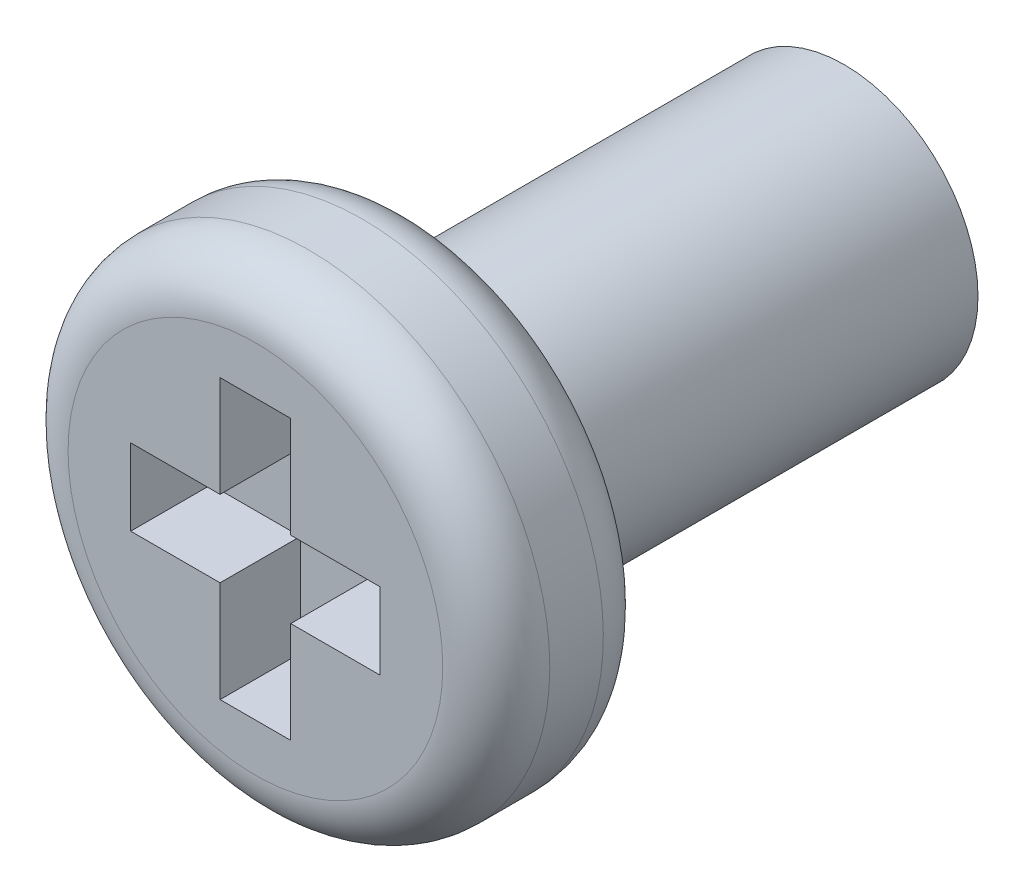
ISO-10303-21;
HEADER;
FILE_DESCRIPTION(('STEP AP214'),'2;1');
FILE_NAME('part.step','',(''),(''),'','','');
FILE_SCHEMA(('AUTOMOTIVE_DESIGN { 1 0 10303 214 1 1 1 1 }'));
ENDSEC;
DATA;
#1=APPLICATION_CONTEXT('core data for automotive mechanical design processes');
#2=APPLICATION_PROTOCOL_DEFINITION('international standard','automotive_design',2000,#1);
#3=PRODUCT_CONTEXT('',#1,'mechanical');
#4=PRODUCT('Part','Part','',(#3));
#5=PRODUCT_RELATED_PRODUCT_CATEGORY('part','',(#4));
#6=PRODUCT_DEFINITION_FORMATION('','',#4);
#7=PRODUCT_DEFINITION_CONTEXT('part definition',#1,'design');
#8=PRODUCT_DEFINITION('design','',#6,#7);
#9=PRODUCT_DEFINITION_SHAPE('','',#8);
#10=(LENGTH_UNIT() NAMED_UNIT(*) SI_UNIT(.MILLI.,.METRE.));
#11=(NAMED_UNIT(*) PLANE_ANGLE_UNIT() SI_UNIT($,.RADIAN.));
#12=(NAMED_UNIT(*) SI_UNIT($,.STERADIAN.) SOLID_ANGLE_UNIT());
#13=UNCERTAINTY_MEASURE_WITH_UNIT(LENGTH_MEASURE(1.E-05),#10,'distance_accuracy_value','');
#14=(GEOMETRIC_REPRESENTATION_CONTEXT(3) GLOBAL_UNCERTAINTY_ASSIGNED_CONTEXT((#13)) GLOBAL_UNIT_ASSIGNED_CONTEXT((#10,
#11,#12)) REPRESENTATION_CONTEXT('',''));
#15=CARTESIAN_POINT('',(0.,0.,0.));
#16=DIRECTION('',(0.,0.,1.));
#17=DIRECTION('',(1.,0.,0.));
#18=AXIS2_PLACEMENT_3D('',#15,#16,#17);
#19=CARTESIAN_POINT('',(-102.7186651452,22.56986742742,59.8));
#20=DIRECTION('',(0.,0.,1.));
#21=DIRECTION('',(0.,1.,0.));
#22=AXIS2_PLACEMENT_3D('',#19,#20,#21);
#23=PLANE('',#22);
#24=DIRECTION('',(1.,0.,0.));
#25=VECTOR('',#24,1.);
#26=CARTESIAN_POINT('',(-106.6368651452,24.56406742742,59.8));
#27=LINE('',#26,#25);
#28=CARTESIAN_POINT('',(-107.4718651452,24.56406742742,59.8));
#29=VERTEX_POINT('',#28);
#30=CARTESIAN_POINT('',(-105.8018651452,24.56406742742,59.8));
#31=VERTEX_POINT('',#30);
#32=EDGE_CURVE('E137',#29,#31,#27,.T.);
#33=ORIENTED_EDGE('',*,*,#32,.T.);
#34=DIRECTION('',(0.,-1.,0.));
#35=VECTOR('',#34,1.);
#36=CARTESIAN_POINT('',(-105.8018651452,23.61906742742,59.8));
#37=LINE('',#36,#35);
#38=CARTESIAN_POINT('',(-105.8018651452,22.67406742742,59.8));
#39=VERTEX_POINT('',#38);
#40=EDGE_CURVE('E119',#31,#39,#37,.T.);
#41=ORIENTED_EDGE('',*,*,#40,.T.);
#42=DIRECTION('',(1.,0.,0.));
#43=VECTOR('',#42,1.);
#44=CARTESIAN_POINT('',(-105.1418651452,22.67406742742,59.8));
#45=LINE('',#44,#43);
#46=CARTESIAN_POINT('',(-104.4818651452,22.67406742742,59.8));
#47=VERTEX_POINT('',#46);
#48=EDGE_CURVE('E125',#39,#47,#45,.T.);
#49=ORIENTED_EDGE('',*,*,#48,.T.);
#50=DIRECTION('',(0.,1.,0.));
#51=VECTOR('',#50,1.);
#52=CARTESIAN_POINT('',(-104.4818651452,23.61906742742,59.8));
#53=LINE('',#52,#51);
#54=CARTESIAN_POINT('',(-104.4818651452,24.56406742742,59.8));
#55=VERTEX_POINT('',#54);
#56=EDGE_CURVE('E261',#47,#55,#53,.T.);
#57=ORIENTED_EDGE('',*,*,#56,.T.);
#58=DIRECTION('',(1.,0.,0.));
#59=VECTOR('',#58,1.);
#60=CARTESIAN_POINT('',(-103.6468651452,24.56406742742,59.8));
#61=LINE('',#60,#59);
#62=CARTESIAN_POINT('',(-102.8118651452,24.56406742742,59.8));
#63=VERTEX_POINT('',#62);
#64=EDGE_CURVE('E267',#55,#63,#61,.T.);
#65=ORIENTED_EDGE('',*,*,#64,.T.);
#66=DIRECTION('',(0.,1.,0.));
#67=VECTOR('',#66,1.);
#68=CARTESIAN_POINT('',(-102.8118651452,25.27906742742,59.8));
#69=LINE('',#68,#67);
#70=CARTESIAN_POINT('',(-102.8118651452,25.99406742742,59.8));
#71=VERTEX_POINT('',#70);
#72=EDGE_CURVE('E273',#63,#71,#69,.T.);
#73=ORIENTED_EDGE('',*,*,#72,.T.);
#74=DIRECTION('',(-1.,0.,0.));
#75=VECTOR('',#74,1.);
#76=CARTESIAN_POINT('',(-103.6468651452,25.99406742742,59.8));
#77=LINE('',#76,#75);
#78=CARTESIAN_POINT('',(-104.4818651452,25.99406742742,59.8));
#79=VERTEX_POINT('',#78);
#80=EDGE_CURVE('E279',#71,#79,#77,.T.);
#81=ORIENTED_EDGE('',*,*,#80,.T.);
#82=DIRECTION('',(0.,1.,0.));
#83=VECTOR('',#82,1.);
#84=CARTESIAN_POINT('',(-104.4818651452,26.93906742742,59.8));
#85=LINE('',#84,#83);
#86=CARTESIAN_POINT('',(-104.4818651452,27.88406742742,59.8));
#87=VERTEX_POINT('',#86);
#88=EDGE_CURVE('E285',#79,#87,#85,.T.);
#89=ORIENTED_EDGE('',*,*,#88,.T.);
#90=DIRECTION('',(-1.,0.,0.));
#91=VECTOR('',#90,1.);
#92=CARTESIAN_POINT('',(-105.1418651452,27.88406742742,59.8));
#93=LINE('',#92,#91);
#94=CARTESIAN_POINT('',(-105.8018651452,27.88406742742,59.8));
#95=VERTEX_POINT('',#94);
#96=EDGE_CURVE('E291',#87,#95,#93,.T.);
#97=ORIENTED_EDGE('',*,*,#96,.T.);
#98=DIRECTION('',(0.,-1.,0.));
#99=VECTOR('',#98,1.);
#100=CARTESIAN_POINT('',(-105.8018651452,26.93906742742,59.8));
#101=LINE('',#100,#99);
#102=CARTESIAN_POINT('',(-105.8018651452,25.99406742742,59.8));
#103=VERTEX_POINT('',#102);
#104=EDGE_CURVE('E297',#95,#103,#101,.T.);
#105=ORIENTED_EDGE('',*,*,#104,.T.);
#106=DIRECTION('',(-1.,0.,0.));
#107=VECTOR('',#106,1.);
#108=CARTESIAN_POINT('',(-106.6368651452,25.99406742742,59.8));
#109=LINE('',#108,#107);
#110=CARTESIAN_POINT('',(-107.4718651452,25.99406742742,59.8));
#111=VERTEX_POINT('',#110);
#112=EDGE_CURVE('E303',#103,#111,#109,.T.);
#113=ORIENTED_EDGE('',*,*,#112,.T.);
#114=DIRECTION('',(0.,-1.,0.));
#115=VECTOR('',#114,1.);
#116=CARTESIAN_POINT('',(-107.4718651452,25.27906742742,59.8));
#117=LINE('',#116,#115);
#118=EDGE_CURVE('E309',#111,#29,#117,.T.);
#119=ORIENTED_EDGE('',*,*,#118,.T.);
#120=EDGE_LOOP('',(#33,#41,#49,#57,#65,#73,#81,#89,#97,#105,#113,#119));
#121=FACE_BOUND('',#120,.T.);
#122=ADVANCED_FACE('F17',(#121),#23,.T.);
#123=CARTESIAN_POINT('',(-105.8282651452,22.67406742742,59.77));
#124=DIRECTION('',(0.,-1.,0.));
#125=DIRECTION('',(1.,0.,0.));
#126=AXIS2_PLACEMENT_3D('',#123,#124,#125);
#127=PLANE('',#126);
#128=ORIENTED_EDGE('',*,*,#48,.F.);
#129=DIRECTION('',(0.,0.,1.));
#130=VECTOR('',#129,1.);
#131=CARTESIAN_POINT('',(-105.8018651452,22.67406742742,60.55));
#132=LINE('',#131,#130);
#133=CARTESIAN_POINT('',(-105.8018651452,22.6740674274205,61.3));
#134=VERTEX_POINT('',#133);
#135=EDGE_CURVE('E128',#39,#134,#132,.T.);
#136=ORIENTED_EDGE('',*,*,#135,.T.);
#137=DIRECTION('',(-1.,0.,0.));
#138=VECTOR('',#137,1.);
#139=CARTESIAN_POINT('',(-105.1418651452,22.6740674274222,61.3));
#140=LINE('',#139,#138);
#141=CARTESIAN_POINT('',(-104.4818651452,22.6740674274205,61.3));
#142=VERTEX_POINT('',#141);
#143=EDGE_CURVE('E260',#142,#134,#140,.T.);
#144=ORIENTED_EDGE('',*,*,#143,.F.);
#145=DIRECTION('',(0.,0.,-1.));
#146=VECTOR('',#145,1.);
#147=CARTESIAN_POINT('',(-104.4818651452,22.67406742742,60.55));
#148=LINE('',#147,#146);
#149=EDGE_CURVE('E130',#142,#47,#148,.T.);
#150=ORIENTED_EDGE('',*,*,#149,.T.);
#151=EDGE_LOOP('',(#128,#136,#144,#150));
#152=FACE_BOUND('',#151,.T.);
#153=ADVANCED_FACE('F126',(#152),#127,.F.);
#154=CARTESIAN_POINT('',(-105.8018651452,24.60186742742,59.77));
#155=DIRECTION('',(-1.,0.,0.));
#156=DIRECTION('',(0.,-1.,0.));
#157=AXIS2_PLACEMENT_3D('',#154,#155,#156);
#158=PLANE('',#157);
#159=ORIENTED_EDGE('',*,*,#40,.F.);
#160=DIRECTION('',(0.,0.,1.));
#161=VECTOR('',#160,1.);
#162=CARTESIAN_POINT('',(-105.8018651452,24.56406742742,60.55));
#163=LINE('',#162,#161);
#164=CARTESIAN_POINT('',(-105.8018651452,24.5640674274201,61.3));
#165=VERTEX_POINT('',#164);
#166=EDGE_CURVE('E311',#31,#165,#163,.T.);
#167=ORIENTED_EDGE('',*,*,#166,.T.);
#168=DIRECTION('',(0.,1.,0.));
#169=VECTOR('',#168,1.);
#170=CARTESIAN_POINT('',(-105.8018651452,25.27906742742,61.3));
#171=LINE('',#170,#169);
#172=EDGE_CURVE('E136',#134,#165,#171,.T.);
#173=ORIENTED_EDGE('',*,*,#172,.F.);
#174=ORIENTED_EDGE('',*,*,#135,.F.);
#175=EDGE_LOOP('',(#159,#167,#173,#174));
#176=FACE_BOUND('',#175,.T.);
#177=ADVANCED_FACE('F135',(#176),#158,.F.);
#178=CARTESIAN_POINT('',(-107.5052651452,24.56406742742,59.77));
#179=DIRECTION('',(0.,-1.,0.));
#180=DIRECTION('',(1.,0.,0.));
#181=AXIS2_PLACEMENT_3D('',#178,#179,#180);
#182=PLANE('',#181);
#183=ORIENTED_EDGE('',*,*,#32,.F.);
#184=DIRECTION('',(0.,0.,1.));
#185=VECTOR('',#184,1.);
#186=CARTESIAN_POINT('',(-107.4718651452,24.56406742742,60.55));
#187=LINE('',#186,#185);
#188=CARTESIAN_POINT('',(-107.4718651452,24.5640674274201,61.3));
#189=VERTEX_POINT('',#188);
#190=EDGE_CURVE('E306',#29,#189,#187,.T.);
#191=ORIENTED_EDGE('',*,*,#190,.T.);
#192=DIRECTION('',(-1.,0.,0.));
#193=VECTOR('',#192,1.);
#194=CARTESIAN_POINT('',(-105.1418651452,24.5640674274206,61.3));
#195=LINE('',#194,#193);
#196=EDGE_CURVE('E314',#165,#189,#195,.T.);
#197=ORIENTED_EDGE('',*,*,#196,.F.);
#198=ORIENTED_EDGE('',*,*,#166,.F.);
#199=EDGE_LOOP('',(#183,#191,#197,#198));
#200=FACE_BOUND('',#199,.T.);
#201=ADVANCED_FACE('F315',(#200),#182,.F.);
#202=CARTESIAN_POINT('',(-107.4718651452,26.02266742742,59.77));
#203=DIRECTION('',(-1.,0.,0.));
#204=DIRECTION('',(0.,-1.,0.));
#205=AXIS2_PLACEMENT_3D('',#202,#203,#204);
#206=PLANE('',#205);
#207=ORIENTED_EDGE('',*,*,#118,.F.);
#208=DIRECTION('',(0.,0.,1.));
#209=VECTOR('',#208,1.);
#210=CARTESIAN_POINT('',(-107.4718651452,25.99406742742,60.55));
#211=LINE('',#210,#209);
#212=CARTESIAN_POINT('',(-107.4718651452,25.9940674274199,61.3));
#213=VERTEX_POINT('',#212);
#214=EDGE_CURVE('E300',#111,#213,#211,.T.);
#215=ORIENTED_EDGE('',*,*,#214,.T.);
#216=DIRECTION('',(0.,1.,0.));
#217=VECTOR('',#216,1.);
#218=CARTESIAN_POINT('',(-107.4718651452,25.27906742742,61.3));
#219=LINE('',#218,#217);
#220=EDGE_CURVE('E318',#189,#213,#219,.T.);
#221=ORIENTED_EDGE('',*,*,#220,.F.);
#222=ORIENTED_EDGE('',*,*,#190,.F.);
#223=EDGE_LOOP('',(#207,#215,#221,#222));
#224=FACE_BOUND('',#223,.T.);
#225=ADVANCED_FACE('F368',(#224),#206,.F.);
#226=CARTESIAN_POINT('',(-105.7684651452,25.99406742742,59.77));
#227=DIRECTION('',(0.,1.,0.));
#228=DIRECTION('',(-1.,0.,0.));
#229=AXIS2_PLACEMENT_3D('',#226,#227,#228);
#230=PLANE('',#229);
#231=ORIENTED_EDGE('',*,*,#112,.F.);
#232=DIRECTION('',(0.,0.,1.));
#233=VECTOR('',#232,1.);
#234=CARTESIAN_POINT('',(-105.8018651452,25.99406742742,60.55));
#235=LINE('',#234,#233);
#236=CARTESIAN_POINT('',(-105.8018651452,25.9940674274199,61.3));
#237=VERTEX_POINT('',#236);
#238=EDGE_CURVE('E294',#103,#237,#235,.T.);
#239=ORIENTED_EDGE('',*,*,#238,.T.);
#240=DIRECTION('',(1.,0.,0.));
#241=VECTOR('',#240,1.);
#242=CARTESIAN_POINT('',(-105.1418651452,25.9940674274194,61.3));
#243=LINE('',#242,#241);
#244=EDGE_CURVE('E320',#213,#237,#243,.T.);
#245=ORIENTED_EDGE('',*,*,#244,.F.);
#246=ORIENTED_EDGE('',*,*,#214,.F.);
#247=EDGE_LOOP('',(#231,#239,#245,#246));
#248=FACE_BOUND('',#247,.T.);
#249=ADVANCED_FACE('F345',(#248),#230,.F.);
#250=CARTESIAN_POINT('',(-105.8018651452,27.92186742742,59.77));
#251=DIRECTION('',(-1.,0.,0.));
#252=DIRECTION('',(0.,-1.,0.));
#253=AXIS2_PLACEMENT_3D('',#250,#251,#252);
#254=PLANE('',#253);
#255=ORIENTED_EDGE('',*,*,#104,.F.);
#256=DIRECTION('',(0.,0.,1.));
#257=VECTOR('',#256,1.);
#258=CARTESIAN_POINT('',(-105.8018651452,27.88406742742,60.55));
#259=LINE('',#258,#257);
#260=CARTESIAN_POINT('',(-105.8018651452,27.8840674274194,61.3));
#261=VERTEX_POINT('',#260);
#262=EDGE_CURVE('E288',#95,#261,#259,.T.);
#263=ORIENTED_EDGE('',*,*,#262,.T.);
#264=DIRECTION('',(0.,1.,0.));
#265=VECTOR('',#264,1.);
#266=CARTESIAN_POINT('',(-105.8018651452,25.27906742742,61.3));
#267=LINE('',#266,#265);
#268=EDGE_CURVE('E339',#237,#261,#267,.T.);
#269=ORIENTED_EDGE('',*,*,#268,.F.);
#270=ORIENTED_EDGE('',*,*,#238,.F.);
#271=EDGE_LOOP('',(#255,#263,#269,#270));
#272=FACE_BOUND('',#271,.T.);
#273=ADVANCED_FACE('F347',(#272),#254,.F.);
#274=CARTESIAN_POINT('',(-104.4554651452,27.88406742742,59.77));
#275=DIRECTION('',(0.,1.,0.));
#276=DIRECTION('',(-1.,0.,0.));
#277=AXIS2_PLACEMENT_3D('',#274,#275,#276);
#278=PLANE('',#277);
#279=ORIENTED_EDGE('',*,*,#96,.F.);
#280=DIRECTION('',(0.,0.,1.));
#281=VECTOR('',#280,1.);
#282=CARTESIAN_POINT('',(-104.4818651452,27.88406742742,60.55));
#283=LINE('',#282,#281);
#284=CARTESIAN_POINT('',(-104.4818651452,27.8840674274195,61.3));
#285=VERTEX_POINT('',#284);
#286=EDGE_CURVE('E282',#87,#285,#283,.T.);
#287=ORIENTED_EDGE('',*,*,#286,.T.);
#288=DIRECTION('',(1.,0.,0.));
#289=VECTOR('',#288,1.);
#290=CARTESIAN_POINT('',(-105.1418651452,27.8840674274179,61.3));
#291=LINE('',#290,#289);
#292=EDGE_CURVE('E337',#261,#285,#291,.T.);
#293=ORIENTED_EDGE('',*,*,#292,.F.);
#294=ORIENTED_EDGE('',*,*,#262,.F.);
#295=EDGE_LOOP('',(#279,#287,#293,#294));
#296=FACE_BOUND('',#295,.T.);
#297=ADVANCED_FACE('F351',(#296),#278,.F.);
#298=CARTESIAN_POINT('',(-104.4818651452,25.95626742742,59.77));
#299=DIRECTION('',(1.,0.,0.));
#300=DIRECTION('',(0.,1.,0.));
#301=AXIS2_PLACEMENT_3D('',#298,#299,#300);
#302=PLANE('',#301);
#303=ORIENTED_EDGE('',*,*,#88,.F.);
#304=DIRECTION('',(0.,0.,1.));
#305=VECTOR('',#304,1.);
#306=CARTESIAN_POINT('',(-104.4818651452,25.99406742742,60.55));
#307=LINE('',#306,#305);
#308=CARTESIAN_POINT('',(-104.4818651452,25.9940674274199,61.3));
#309=VERTEX_POINT('',#308);
#310=EDGE_CURVE('E276',#79,#309,#307,.T.);
#311=ORIENTED_EDGE('',*,*,#310,.T.);
#312=DIRECTION('',(0.,-1.,0.));
#313=VECTOR('',#312,1.);
#314=CARTESIAN_POINT('',(-104.4818651452,25.27906742742,61.3));
#315=LINE('',#314,#313);
#316=EDGE_CURVE('E335',#285,#309,#315,.T.);
#317=ORIENTED_EDGE('',*,*,#316,.F.);
#318=ORIENTED_EDGE('',*,*,#286,.F.);
#319=EDGE_LOOP('',(#303,#311,#317,#318));
#320=FACE_BOUND('',#319,.T.);
#321=ADVANCED_FACE('F357',(#320),#302,.F.);
#322=CARTESIAN_POINT('',(-102.7784651452,25.99406742742,59.77));
#323=DIRECTION('',(0.,1.,0.));
#324=DIRECTION('',(-1.,0.,0.));
#325=AXIS2_PLACEMENT_3D('',#322,#323,#324);
#326=PLANE('',#325);
#327=ORIENTED_EDGE('',*,*,#80,.F.);
#328=DIRECTION('',(0.,0.,1.));
#329=VECTOR('',#328,1.);
#330=CARTESIAN_POINT('',(-102.8118651452,25.99406742742,60.55));
#331=LINE('',#330,#329);
#332=CARTESIAN_POINT('',(-102.8118651452,25.9940674274199,61.3));
#333=VERTEX_POINT('',#332);
#334=EDGE_CURVE('E270',#71,#333,#331,.T.);
#335=ORIENTED_EDGE('',*,*,#334,.T.);
#336=DIRECTION('',(1.,0.,0.));
#337=VECTOR('',#336,1.);
#338=CARTESIAN_POINT('',(-105.1418651452,25.9940674274194,61.3));
#339=LINE('',#338,#337);
#340=EDGE_CURVE('E331',#309,#333,#339,.T.);
#341=ORIENTED_EDGE('',*,*,#340,.F.);
#342=ORIENTED_EDGE('',*,*,#310,.F.);
#343=EDGE_LOOP('',(#327,#335,#341,#342));
#344=FACE_BOUND('',#343,.T.);
#345=ADVANCED_FACE('F359',(#344),#326,.F.);
#346=CARTESIAN_POINT('',(-102.8118651452,24.53546742742,59.77));
#347=DIRECTION('',(1.,0.,0.));
#348=DIRECTION('',(0.,1.,0.));
#349=AXIS2_PLACEMENT_3D('',#346,#347,#348);
#350=PLANE('',#349);
#351=ORIENTED_EDGE('',*,*,#72,.F.);
#352=DIRECTION('',(0.,0.,1.));
#353=VECTOR('',#352,1.);
#354=CARTESIAN_POINT('',(-102.8118651452,24.56406742742,60.55));
#355=LINE('',#354,#353);
#356=CARTESIAN_POINT('',(-102.8118651452,24.5640674274201,61.3));
#357=VERTEX_POINT('',#356);
#358=EDGE_CURVE('E264',#63,#357,#355,.T.);
#359=ORIENTED_EDGE('',*,*,#358,.T.);
#360=DIRECTION('',(0.,-1.,0.));
#361=VECTOR('',#360,1.);
#362=CARTESIAN_POINT('',(-102.8118651452,25.27906742742,61.3));
#363=LINE('',#362,#361);
#364=EDGE_CURVE('E330',#333,#357,#363,.T.);
#365=ORIENTED_EDGE('',*,*,#364,.F.);
#366=ORIENTED_EDGE('',*,*,#334,.F.);
#367=EDGE_LOOP('',(#351,#359,#365,#366));
#368=FACE_BOUND('',#367,.T.);
#369=ADVANCED_FACE('F363',(#368),#350,.F.);
#370=CARTESIAN_POINT('',(-104.5152651452,24.56406742742,59.77));
#371=DIRECTION('',(0.,-1.,0.));
#372=DIRECTION('',(1.,0.,0.));
#373=AXIS2_PLACEMENT_3D('',#370,#371,#372);
#374=PLANE('',#373);
#375=ORIENTED_EDGE('',*,*,#64,.F.);
#376=DIRECTION('',(0.,0.,1.));
#377=VECTOR('',#376,1.);
#378=CARTESIAN_POINT('',(-104.4818651452,24.56406742742,60.55));
#379=LINE('',#378,#377);
#380=CARTESIAN_POINT('',(-104.4818651452,24.5640674274201,61.3));
#381=VERTEX_POINT('',#380);
#382=EDGE_CURVE('E252',#55,#381,#379,.T.);
#383=ORIENTED_EDGE('',*,*,#382,.T.);
#384=DIRECTION('',(-1.,0.,0.));
#385=VECTOR('',#384,1.);
#386=CARTESIAN_POINT('',(-105.1418651452,24.5640674274206,61.3));
#387=LINE('',#386,#385);
#388=EDGE_CURVE('E327',#357,#381,#387,.T.);
#389=ORIENTED_EDGE('',*,*,#388,.F.);
#390=ORIENTED_EDGE('',*,*,#358,.F.);
#391=EDGE_LOOP('',(#375,#383,#389,#390));
#392=FACE_BOUND('',#391,.T.);
#393=ADVANCED_FACE('F366',(#392),#374,.F.);
#394=CARTESIAN_POINT('',(-104.4818651452,22.63626742742,59.77));
#395=DIRECTION('',(1.,0.,0.));
#396=DIRECTION('',(0.,1.,0.));
#397=AXIS2_PLACEMENT_3D('',#394,#395,#396);
#398=PLANE('',#397);
#399=ORIENTED_EDGE('',*,*,#56,.F.);
#400=ORIENTED_EDGE('',*,*,#149,.F.);
#401=DIRECTION('',(0.,-1.,0.));
#402=VECTOR('',#401,1.);
#403=CARTESIAN_POINT('',(-104.4818651452,25.27906742742,61.3));
#404=LINE('',#403,#402);
#405=EDGE_CURVE('E238',#381,#142,#404,.T.);
#406=ORIENTED_EDGE('',*,*,#405,.F.);
#407=ORIENTED_EDGE('',*,*,#382,.F.);
#408=EDGE_LOOP('',(#399,#400,#406,#407));
#409=FACE_BOUND('',#408,.T.);
#410=ADVANCED_FACE('F164',(#409),#398,.F.);
#411=CARTESIAN_POINT('',(-108.7818651452,21.63906743188,61.3));
#412=DIRECTION('',(0.,0.,1.));
#413=DIRECTION('',(1.,0.,0.));
#414=AXIS2_PLACEMENT_3D('',#411,#412,#413);
#415=PLANE('',#414);
#416=ORIENTED_EDGE('',*,*,#388,.T.);
#417=ORIENTED_EDGE('',*,*,#405,.T.);
#418=ORIENTED_EDGE('',*,*,#143,.T.);
#419=ORIENTED_EDGE('',*,*,#172,.T.);
#420=ORIENTED_EDGE('',*,*,#196,.T.);
#421=ORIENTED_EDGE('',*,*,#220,.T.);
#422=ORIENTED_EDGE('',*,*,#244,.T.);
#423=ORIENTED_EDGE('',*,*,#268,.T.);
#424=ORIENTED_EDGE('',*,*,#292,.T.);
#425=ORIENTED_EDGE('',*,*,#316,.T.);
#426=ORIENTED_EDGE('',*,*,#340,.T.);
#427=ORIENTED_EDGE('',*,*,#364,.T.);
#428=EDGE_LOOP('',(#416,#417,#418,#419,#420,#421,#422,#423,#424,#425,#426,#427));
#429=FACE_BOUND('',#428,.T.);
#430=CARTESIAN_POINT('',(-105.1418651452,25.27906742742,61.3));
#431=DIRECTION('',(0.,0.,-1.));
#432=DIRECTION('',(1.,-4.49342943804406E-12,0.));
#433=AXIS2_PLACEMENT_3D('',#430,#431,#432);
#434=CIRCLE('',#433,3.50000000001147);
#435=CARTESIAN_POINT('',(-108.641865145207,25.2790674274234,61.3));
#436=VERTEX_POINT('',#435);
#437=CARTESIAN_POINT('',(-101.641865145193,25.2790674274105,61.3));
#438=VERTEX_POINT('',#437);
#439=EDGE_CURVE('E148',#436,#438,#434,.F.);
#440=ORIENTED_EDGE('',*,*,#439,.T.);
#441=CARTESIAN_POINT('',(-105.1418651452,25.27906742742,61.3));
#442=DIRECTION('',(0.,0.,-1.));
#443=DIRECTION('',(-1.,1.59396305677803E-12,0.));
#444=AXIS2_PLACEMENT_3D('',#441,#442,#443);
#445=CIRCLE('',#444,3.50000000001149);
#446=EDGE_CURVE('E235',#438,#436,#445,.F.);
#447=ORIENTED_EDGE('',*,*,#446,.T.);
#448=EDGE_LOOP('',(#440,#447));
#449=FACE_BOUND('',#448,.T.);
#450=ADVANCED_FACE('F154',(#429,#449),#415,.T.);
#451=CARTESIAN_POINT('',(-105.1418651452,25.27906742742,60.3));
#452=DIRECTION('',(0.,0.,1.));
#453=DIRECTION('',(0.999983479339601,-0.00574813429426718,0.));
#454=AXIS2_PLACEMENT_3D('',#451,#452,#453);
#455=TOROIDAL_SURFACE('',#454,3.50000000001138,1.);
#456=CARTESIAN_POINT('',(-105.1418651452,25.27906742742,60.3));
#457=DIRECTION('',(0.,0.,1.));
#458=DIRECTION('',(1.,0.,0.));
#459=AXIS2_PLACEMENT_3D('',#456,#457,#458);
#460=CIRCLE('',#459,4.5);
#461=CARTESIAN_POINT('',(-100.6418651452,25.27906742742,60.3));
#462=VERTEX_POINT('',#461);
#463=EDGE_CURVE('E232',#462,#462,#460,.T.);
#464=ORIENTED_EDGE('',*,*,#463,.T.);
#465=EDGE_LOOP('',(#464));
#466=FACE_BOUND('',#465,.T.);
#467=ORIENTED_EDGE('',*,*,#439,.F.);
#468=ORIENTED_EDGE('',*,*,#446,.F.);
#469=EDGE_LOOP('',(#467,#468));
#470=FACE_BOUND('',#469,.T.);
#471=ADVANCED_FACE('F163',(#466,#470),#455,.T.);
#472=CARTESIAN_POINT('',(-105.1418651452,25.27906742742,59.3));
#473=DIRECTION('',(0.,0.,1.));
#474=DIRECTION('',(0.,-1.,0.));
#475=AXIS2_PLACEMENT_3D('',#472,#473,#474);
#476=CYLINDRICAL_SURFACE('',#475,4.5);
#477=CARTESIAN_POINT('',(-105.1418651452,25.27906742742,59.3));
#478=DIRECTION('',(0.,0.,1.));
#479=DIRECTION('',(-0.999966661758723,-0.00816549882831299,0.));
#480=AXIS2_PLACEMENT_3D('',#477,#478,#479);
#481=CIRCLE('',#480,4.49999999994453);
#482=CARTESIAN_POINT('',(-109.641715123059,25.242322682693,59.3));
#483=VERTEX_POINT('',#482);
#484=EDGE_CURVE('E198',#483,#483,#481,.T.);
#485=ORIENTED_EDGE('',*,*,#484,.T.);
#486=EDGE_LOOP('',(#485));
#487=FACE_BOUND('',#486,.T.);
#488=ORIENTED_EDGE('',*,*,#463,.F.);
#489=EDGE_LOOP('',(#488));
#490=FACE_BOUND('',#489,.T.);
#491=ADVANCED_FACE('F217',(#487,#490),#476,.T.);
#492=CARTESIAN_POINT('',(-107.7418651452,27.88167244517,50.3));
#493=DIRECTION('',(0.,0.,-1.));
#494=DIRECTION('',(1.,0.,0.));
#495=AXIS2_PLACEMENT_3D('',#492,#493,#494);
#496=PLANE('',#495);
#497=CARTESIAN_POINT('',(-105.1418651452,25.27906742742,50.3));
#498=DIRECTION('',(0.,0.,-1.));
#499=DIRECTION('',(-1.,0.,0.));
#500=AXIS2_PLACEMENT_3D('',#497,#498,#499);
#501=CIRCLE('',#500,2.5);
#502=CARTESIAN_POINT('',(-107.6418651452,25.27906742742,50.3));
#503=VERTEX_POINT('',#502);
#504=EDGE_CURVE('E195',#503,#503,#501,.T.);
#505=ORIENTED_EDGE('',*,*,#504,.T.);
#506=EDGE_LOOP('',(#505));
#507=FACE_BOUND('',#506,.T.);
#508=ADVANCED_FACE('F167',(#507),#496,.T.);
#509=CARTESIAN_POINT('',(-105.1418651452,25.27906742742,59.3));
#510=DIRECTION('',(0.,0.,1.));
#511=DIRECTION('',(-0.99996666175872,-0.00816549882870165,0.));
#512=AXIS2_PLACEMENT_3D('',#509,#510,#511);
#513=TOROIDAL_SURFACE('',#512,3.49999999994449,1.);
#514=ORIENTED_EDGE('',*,*,#484,.F.);
#515=EDGE_LOOP('',(#514));
#516=FACE_BOUND('',#515,.T.);
#517=CARTESIAN_POINT('',(-105.1418651452,25.27906742742,58.3));
#518=DIRECTION('',(0.,0.,1.));
#519=DIRECTION('',(-1.,1.27180012551431E-12,0.));
#520=AXIS2_PLACEMENT_3D('',#517,#518,#519);
#521=CIRCLE('',#520,3.50000000004436);
#522=CARTESIAN_POINT('',(-108.641865145187,25.2790674274103,58.3));
#523=VERTEX_POINT('',#522);
#524=CARTESIAN_POINT('',(-101.641865145213,25.2790674274257,58.3));
#525=VERTEX_POINT('',#524);
#526=EDGE_CURVE('E178',#523,#525,#521,.T.);
#527=ORIENTED_EDGE('',*,*,#526,.T.);
#528=CARTESIAN_POINT('',(-105.1418651452,25.27906742742,58.3));
#529=DIRECTION('',(0.,0.,1.));
#530=DIRECTION('',(1.,1.82691163787198E-12,0.));
#531=AXIS2_PLACEMENT_3D('',#528,#529,#530);
#532=CIRCLE('',#531,3.49999999994449);
#533=EDGE_CURVE('E30',#525,#523,#532,.T.);
#534=ORIENTED_EDGE('',*,*,#533,.T.);
#535=EDGE_LOOP('',(#527,#534));
#536=FACE_BOUND('',#535,.T.);
#537=ADVANCED_FACE('F204',(#516,#536),#513,.T.);
#538=CARTESIAN_POINT('',(-105.1418651452,25.27906742742,58.3));
#539=DIRECTION('',(0.,0.,-1.));
#540=DIRECTION('',(-1.,0.,0.));
#541=AXIS2_PLACEMENT_3D('',#538,#539,#540);
#542=CYLINDRICAL_SURFACE('',#541,2.5);
#543=ORIENTED_EDGE('',*,*,#504,.F.);
#544=EDGE_LOOP('',(#543));
#545=FACE_BOUND('',#544,.T.);
#546=CARTESIAN_POINT('',(-105.1418651452,25.27906742742,58.3));
#547=DIRECTION('',(0.,0.,-1.));
#548=DIRECTION('',(-1.,0.,0.));
#549=AXIS2_PLACEMENT_3D('',#546,#547,#548);
#550=CIRCLE('',#549,2.5);
#551=CARTESIAN_POINT('',(-107.6418651452,25.27906742742,58.3));
#552=VERTEX_POINT('',#551);
#553=EDGE_CURVE('E11',#552,#552,#550,.T.);
#554=ORIENTED_EDGE('',*,*,#553,.T.);
#555=EDGE_LOOP('',(#554));
#556=FACE_BOUND('',#555,.T.);
#557=ADVANCED_FACE('F215',(#545,#556),#542,.T.);
#558=CARTESIAN_POINT('',(-108.7818651452,21.63906743188,58.3));
#559=DIRECTION('',(0.,0.,1.));
#560=DIRECTION('',(1.,0.,0.));
#561=AXIS2_PLACEMENT_3D('',#558,#559,#560);
#562=PLANE('',#561);
#563=ORIENTED_EDGE('',*,*,#553,.F.);
#564=EDGE_LOOP('',(#563));
#565=FACE_BOUND('',#564,.T.);
#566=ORIENTED_EDGE('',*,*,#526,.F.);
#567=ORIENTED_EDGE('',*,*,#533,.F.);
#568=EDGE_LOOP('',(#566,#567));
#569=FACE_BOUND('',#568,.T.);
#570=ADVANCED_FACE('F19',(#565,#569),#562,.F.);
#571=CLOSED_SHELL('',(#122,#153,#177,#201,#225,#249,#273,#297,#321,#345,#369,#393,#410,#450,
#471,#491,#508,#537,#557,#570));
#572=MANIFOLD_SOLID_BREP('B1',#571);
#573=ADVANCED_BREP_SHAPE_REPRESENTATION('',(#18,#572),#14);
#574=SHAPE_DEFINITION_REPRESENTATION(#9,#573);
ENDSEC;
END-ISO-10303-21;
